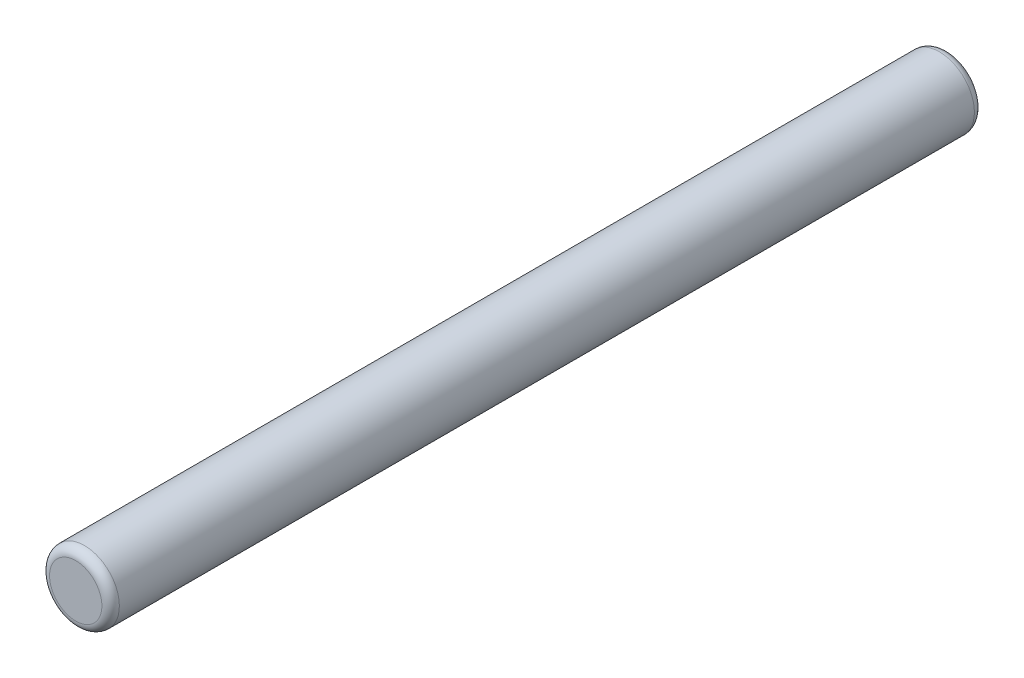
ISO-10303-21;
HEADER;
FILE_DESCRIPTION(('STEP AP214'),'2;1');
FILE_NAME('part.step','',(''),(''),'','','');
FILE_SCHEMA(('AUTOMOTIVE_DESIGN { 1 0 10303 214 1 1 1 1 }'));
ENDSEC;
DATA;
#1=APPLICATION_CONTEXT('core data for automotive mechanical design processes');
#2=APPLICATION_PROTOCOL_DEFINITION('international standard','automotive_design',2000,#1);
#3=PRODUCT_CONTEXT('',#1,'mechanical');
#4=PRODUCT('Part','Part','',(#3));
#5=PRODUCT_RELATED_PRODUCT_CATEGORY('part','',(#4));
#6=PRODUCT_DEFINITION_FORMATION('','',#4);
#7=PRODUCT_DEFINITION_CONTEXT('part definition',#1,'design');
#8=PRODUCT_DEFINITION('design','',#6,#7);
#9=PRODUCT_DEFINITION_SHAPE('','',#8);
#10=(LENGTH_UNIT() NAMED_UNIT(*) SI_UNIT(.MILLI.,.METRE.));
#11=(NAMED_UNIT(*) PLANE_ANGLE_UNIT() SI_UNIT($,.RADIAN.));
#12=(NAMED_UNIT(*) SI_UNIT($,.STERADIAN.) SOLID_ANGLE_UNIT());
#13=UNCERTAINTY_MEASURE_WITH_UNIT(LENGTH_MEASURE(1.E-05),#10,'distance_accuracy_value','');
#14=(GEOMETRIC_REPRESENTATION_CONTEXT(3) GLOBAL_UNCERTAINTY_ASSIGNED_CONTEXT((#13)) GLOBAL_UNIT_ASSIGNED_CONTEXT((#10,
#11,#12)) REPRESENTATION_CONTEXT('',''));
#15=CARTESIAN_POINT('',(0.,0.,0.));
#16=DIRECTION('',(0.,0.,1.));
#17=DIRECTION('',(1.,0.,0.));
#18=AXIS2_PLACEMENT_3D('',#15,#16,#17);
#19=CARTESIAN_POINT('',(0.,0.,100.));
#20=DIRECTION('',(0.,0.,-1.));
#21=DIRECTION('',(-1.,0.,0.));
#22=AXIS2_PLACEMENT_3D('',#19,#20,#21);
#23=CYLINDRICAL_SURFACE('',#22,4.);
#24=CARTESIAN_POINT('',(0.,0.,99.));
#25=DIRECTION('',(0.,0.,1.));
#26=DIRECTION('',(1.,0.,0.));
#27=AXIS2_PLACEMENT_3D('',#24,#25,#26);
#28=CIRCLE('',#27,4.);
#29=CARTESIAN_POINT('',(4.,0.,99.));
#30=VERTEX_POINT('',#29);
#31=EDGE_CURVE('E40',#30,#30,#28,.F.);
#32=ORIENTED_EDGE('',*,*,#31,.T.);
#33=EDGE_LOOP('',(#32));
#34=FACE_BOUND('',#33,.T.);
#35=CARTESIAN_POINT('',(0.,0.,1.));
#36=DIRECTION('',(0.,0.,1.));
#37=DIRECTION('',(1.,0.,0.));
#38=AXIS2_PLACEMENT_3D('',#35,#36,#37);
#39=CIRCLE('',#38,4.);
#40=CARTESIAN_POINT('',(4.,0.,1.));
#41=VERTEX_POINT('',#40);
#42=EDGE_CURVE('E44',#41,#41,#39,.T.);
#43=ORIENTED_EDGE('',*,*,#42,.T.);
#44=EDGE_LOOP('',(#43));
#45=FACE_BOUND('',#44,.T.);
#46=ADVANCED_FACE('F33',(#34,#45),#23,.T.);
#47=CARTESIAN_POINT('',(0.,0.,100.));
#48=DIRECTION('',(0.,0.,1.));
#49=DIRECTION('',(1.,0.,0.));
#50=AXIS2_PLACEMENT_3D('',#47,#48,#49);
#51=PLANE('',#50);
#52=CARTESIAN_POINT('',(0.,0.,100.));
#53=DIRECTION('',(0.,0.,1.));
#54=DIRECTION('',(1.,0.,0.));
#55=AXIS2_PLACEMENT_3D('',#52,#53,#54);
#56=CIRCLE('',#55,3.);
#57=CARTESIAN_POINT('',(3.,0.,100.));
#58=VERTEX_POINT('',#57);
#59=EDGE_CURVE('E48',#58,#58,#56,.T.);
#60=ORIENTED_EDGE('',*,*,#59,.T.);
#61=EDGE_LOOP('',(#60));
#62=FACE_BOUND('',#61,.T.);
#63=ADVANCED_FACE('F54',(#62),#51,.T.);
#64=CARTESIAN_POINT('',(0.,0.,0.));
#65=DIRECTION('',(0.,0.,1.));
#66=DIRECTION('',(1.,0.,0.));
#67=AXIS2_PLACEMENT_3D('',#64,#65,#66);
#68=PLANE('',#67);
#69=CARTESIAN_POINT('',(0.,0.,0.));
#70=DIRECTION('',(0.,0.,1.));
#71=DIRECTION('',(1.,0.,0.));
#72=AXIS2_PLACEMENT_3D('',#69,#70,#71);
#73=CIRCLE('',#72,3.);
#74=CARTESIAN_POINT('',(3.,0.,0.));
#75=VERTEX_POINT('',#74);
#76=EDGE_CURVE('E10',#75,#75,#73,.F.);
#77=ORIENTED_EDGE('',*,*,#76,.T.);
#78=EDGE_LOOP('',(#77));
#79=FACE_BOUND('',#78,.T.);
#80=ADVANCED_FACE('F58',(#79),#68,.F.);
#81=CARTESIAN_POINT('',(0.,0.,99.));
#82=DIRECTION('',(0.,0.,1.));
#83=DIRECTION('',(1.,0.,0.));
#84=AXIS2_PLACEMENT_3D('',#81,#82,#83);
#85=TOROIDAL_SURFACE('',#84,3.,1.);
#86=ORIENTED_EDGE('',*,*,#31,.F.);
#87=EDGE_LOOP('',(#86));
#88=FACE_BOUND('',#87,.T.);
#89=ORIENTED_EDGE('',*,*,#59,.F.);
#90=EDGE_LOOP('',(#89));
#91=FACE_BOUND('',#90,.T.);
#92=ADVANCED_FACE('F56',(#88,#91),#85,.T.);
#93=CARTESIAN_POINT('',(0.,0.,1.));
#94=DIRECTION('',(0.,0.,1.));
#95=DIRECTION('',(1.,0.,0.));
#96=AXIS2_PLACEMENT_3D('',#93,#94,#95);
#97=TOROIDAL_SURFACE('',#96,3.,1.);
#98=ORIENTED_EDGE('',*,*,#76,.F.);
#99=EDGE_LOOP('',(#98));
#100=FACE_BOUND('',#99,.T.);
#101=ORIENTED_EDGE('',*,*,#42,.F.);
#102=EDGE_LOOP('',(#101));
#103=FACE_BOUND('',#102,.T.);
#104=ADVANCED_FACE('F35',(#100,#103),#97,.T.);
#105=CLOSED_SHELL('',(#46,#63,#80,#92,#104));
#106=MANIFOLD_SOLID_BREP('B2',#105);
#107=ADVANCED_BREP_SHAPE_REPRESENTATION('',(#18,#106),#14);
#108=SHAPE_DEFINITION_REPRESENTATION(#9,#107);
ENDSEC;
END-ISO-10303-21;
